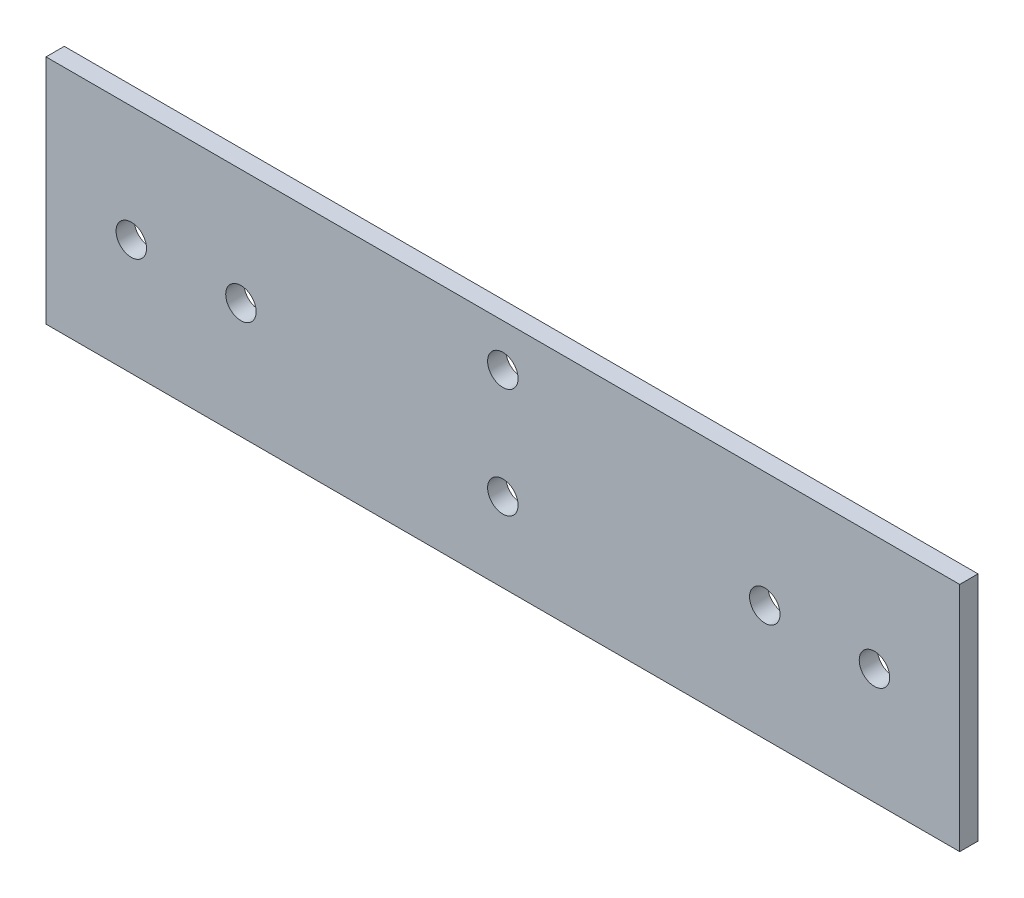
ISO-10303-21;
HEADER;
FILE_DESCRIPTION(('STEP AP214'),'2;1');
FILE_NAME('part.step','',(''),(''),'','','');
FILE_SCHEMA(('AUTOMOTIVE_DESIGN { 1 0 10303 214 1 1 1 1 }'));
ENDSEC;
DATA;
#1=APPLICATION_CONTEXT('core data for automotive mechanical design processes');
#2=APPLICATION_PROTOCOL_DEFINITION('international standard','automotive_design',2000,#1);
#3=PRODUCT_CONTEXT('',#1,'mechanical');
#4=PRODUCT('Part','Part','',(#3));
#5=PRODUCT_RELATED_PRODUCT_CATEGORY('part','',(#4));
#6=PRODUCT_DEFINITION_FORMATION('','',#4);
#7=PRODUCT_DEFINITION_CONTEXT('part definition',#1,'design');
#8=PRODUCT_DEFINITION('design','',#6,#7);
#9=PRODUCT_DEFINITION_SHAPE('','',#8);
#10=(LENGTH_UNIT() NAMED_UNIT(*) SI_UNIT(.MILLI.,.METRE.));
#11=(NAMED_UNIT(*) PLANE_ANGLE_UNIT() SI_UNIT($,.RADIAN.));
#12=(NAMED_UNIT(*) SI_UNIT($,.STERADIAN.) SOLID_ANGLE_UNIT());
#13=UNCERTAINTY_MEASURE_WITH_UNIT(LENGTH_MEASURE(1.E-05),#10,'distance_accuracy_value','');
#14=(GEOMETRIC_REPRESENTATION_CONTEXT(3) GLOBAL_UNCERTAINTY_ASSIGNED_CONTEXT((#13)) GLOBAL_UNIT_ASSIGNED_CONTEXT((#10,
#11,#12)) REPRESENTATION_CONTEXT('',''));
#15=CARTESIAN_POINT('',(0.,0.,0.));
#16=DIRECTION('',(0.,0.,1.));
#17=DIRECTION('',(1.,0.,0.));
#18=AXIS2_PLACEMENT_3D('',#15,#16,#17);
#19=CARTESIAN_POINT('',(75.,19.,3.));
#20=DIRECTION('',(-1.,0.,0.));
#21=DIRECTION('',(0.,0.,1.));
#22=AXIS2_PLACEMENT_3D('',#19,#20,#21);
#23=PLANE('',#22);
#24=DIRECTION('',(0.,1.,0.));
#25=VECTOR('',#24,1.);
#26=CARTESIAN_POINT('',(75.,19.,0.));
#27=LINE('',#26,#25);
#28=CARTESIAN_POINT('',(75.,-19.,0.));
#29=VERTEX_POINT('',#28);
#30=CARTESIAN_POINT('',(75.,19.,0.));
#31=VERTEX_POINT('',#30);
#32=EDGE_CURVE('E106',#29,#31,#27,.T.);
#33=ORIENTED_EDGE('',*,*,#32,.T.);
#34=DIRECTION('',(0.,0.,-1.));
#35=VECTOR('',#34,1.);
#36=CARTESIAN_POINT('',(75.,19.,3.));
#37=LINE('',#36,#35);
#38=CARTESIAN_POINT('',(75.,19.,3.));
#39=VERTEX_POINT('',#38);
#40=EDGE_CURVE('E11',#39,#31,#37,.T.);
#41=ORIENTED_EDGE('',*,*,#40,.F.);
#42=DIRECTION('',(0.,1.,0.));
#43=VECTOR('',#42,1.);
#44=CARTESIAN_POINT('',(75.,19.,3.));
#45=LINE('',#44,#43);
#46=CARTESIAN_POINT('',(75.,-19.,3.));
#47=VERTEX_POINT('',#46);
#48=EDGE_CURVE('E90',#47,#39,#45,.T.);
#49=ORIENTED_EDGE('',*,*,#48,.F.);
#50=DIRECTION('',(0.,0.,-1.));
#51=VECTOR('',#50,1.);
#52=CARTESIAN_POINT('',(75.,-19.,3.));
#53=LINE('',#52,#51);
#54=EDGE_CURVE('E102',#47,#29,#53,.T.);
#55=ORIENTED_EDGE('',*,*,#54,.T.);
#56=EDGE_LOOP('',(#33,#41,#49,#55));
#57=FACE_BOUND('',#56,.T.);
#58=ADVANCED_FACE('F38',(#57),#23,.F.);
#59=CARTESIAN_POINT('',(-75.,19.,3.));
#60=DIRECTION('',(0.,-1.,0.));
#61=DIRECTION('',(0.,0.,-1.));
#62=AXIS2_PLACEMENT_3D('',#59,#60,#61);
#63=PLANE('',#62);
#64=DIRECTION('',(-1.,0.,0.));
#65=VECTOR('',#64,1.);
#66=CARTESIAN_POINT('',(-75.,19.,0.));
#67=LINE('',#66,#65);
#68=CARTESIAN_POINT('',(-75.,19.,0.));
#69=VERTEX_POINT('',#68);
#70=EDGE_CURVE('E95',#31,#69,#67,.T.);
#71=ORIENTED_EDGE('',*,*,#70,.T.);
#72=DIRECTION('',(0.,0.,-1.));
#73=VECTOR('',#72,1.);
#74=CARTESIAN_POINT('',(-75.,19.,3.));
#75=LINE('',#74,#73);
#76=CARTESIAN_POINT('',(-75.,19.,3.));
#77=VERTEX_POINT('',#76);
#78=EDGE_CURVE('E47',#77,#69,#75,.T.);
#79=ORIENTED_EDGE('',*,*,#78,.F.);
#80=DIRECTION('',(-1.,0.,0.));
#81=VECTOR('',#80,1.);
#82=CARTESIAN_POINT('',(-75.,19.,3.));
#83=LINE('',#82,#81);
#84=EDGE_CURVE('E85',#39,#77,#83,.T.);
#85=ORIENTED_EDGE('',*,*,#84,.F.);
#86=ORIENTED_EDGE('',*,*,#40,.T.);
#87=EDGE_LOOP('',(#71,#79,#85,#86));
#88=FACE_BOUND('',#87,.T.);
#89=ADVANCED_FACE('F94',(#88),#63,.F.);
#90=CARTESIAN_POINT('',(-75.,19.,3.));
#91=DIRECTION('',(1.,0.,0.));
#92=DIRECTION('',(0.,0.,-1.));
#93=AXIS2_PLACEMENT_3D('',#90,#91,#92);
#94=PLANE('',#93);
#95=DIRECTION('',(0.,-1.,0.));
#96=VECTOR('',#95,1.);
#97=CARTESIAN_POINT('',(-75.,19.,0.));
#98=LINE('',#97,#96);
#99=CARTESIAN_POINT('',(-75.,-19.,0.));
#100=VERTEX_POINT('',#99);
#101=EDGE_CURVE('E72',#69,#100,#98,.T.);
#102=ORIENTED_EDGE('',*,*,#101,.T.);
#103=DIRECTION('',(0.,0.,-1.));
#104=VECTOR('',#103,1.);
#105=CARTESIAN_POINT('',(-75.,-19.,3.));
#106=LINE('',#105,#104);
#107=CARTESIAN_POINT('',(-75.,-19.,3.));
#108=VERTEX_POINT('',#107);
#109=EDGE_CURVE('E97',#108,#100,#106,.T.);
#110=ORIENTED_EDGE('',*,*,#109,.F.);
#111=DIRECTION('',(0.,-1.,0.));
#112=VECTOR('',#111,1.);
#113=CARTESIAN_POINT('',(-75.,19.,3.));
#114=LINE('',#113,#112);
#115=EDGE_CURVE('E88',#77,#108,#114,.T.);
#116=ORIENTED_EDGE('',*,*,#115,.F.);
#117=ORIENTED_EDGE('',*,*,#78,.T.);
#118=EDGE_LOOP('',(#102,#110,#116,#117));
#119=FACE_BOUND('',#118,.T.);
#120=ADVANCED_FACE('F98',(#119),#94,.F.);
#121=CARTESIAN_POINT('',(-75.,-19.,3.));
#122=DIRECTION('',(0.,1.,0.));
#123=DIRECTION('',(0.,0.,1.));
#124=AXIS2_PLACEMENT_3D('',#121,#122,#123);
#125=PLANE('',#124);
#126=DIRECTION('',(1.,0.,0.));
#127=VECTOR('',#126,1.);
#128=CARTESIAN_POINT('',(-75.,-19.,0.));
#129=LINE('',#128,#127);
#130=EDGE_CURVE('E78',#100,#29,#129,.T.);
#131=ORIENTED_EDGE('',*,*,#130,.T.);
#132=ORIENTED_EDGE('',*,*,#54,.F.);
#133=DIRECTION('',(1.,0.,0.));
#134=VECTOR('',#133,1.);
#135=CARTESIAN_POINT('',(-75.,-19.,3.));
#136=LINE('',#135,#134);
#137=EDGE_CURVE('E55',#108,#47,#136,.T.);
#138=ORIENTED_EDGE('',*,*,#137,.F.);
#139=ORIENTED_EDGE('',*,*,#109,.T.);
#140=EDGE_LOOP('',(#131,#132,#138,#139));
#141=FACE_BOUND('',#140,.T.);
#142=ADVANCED_FACE('F120',(#141),#125,.F.);
#143=CARTESIAN_POINT('',(0.,0.,3.));
#144=DIRECTION('',(0.,0.,1.));
#145=DIRECTION('',(1.,0.,0.));
#146=AXIS2_PLACEMENT_3D('',#143,#144,#145);
#147=PLANE('',#146);
#148=CARTESIAN_POINT('',(0.,-6.,3.));
#149=DIRECTION('',(0.,0.,1.));
#150=DIRECTION('',(1.,0.,0.));
#151=AXIS2_PLACEMENT_3D('',#148,#149,#150);
#152=CIRCLE('',#151,2.5);
#153=CARTESIAN_POINT('',(-2.5,-6.,3.));
#154=VERTEX_POINT('',#153);
#155=EDGE_CURVE('E167',#154,#154,#152,.F.);
#156=ORIENTED_EDGE('',*,*,#155,.T.);
#157=EDGE_LOOP('',(#156));
#158=FACE_BOUND('',#157,.T.);
#159=CARTESIAN_POINT('',(0.,12.,3.));
#160=DIRECTION('',(0.,0.,1.));
#161=DIRECTION('',(1.,0.,0.));
#162=AXIS2_PLACEMENT_3D('',#159,#160,#161);
#163=CIRCLE('',#162,2.5);
#164=CARTESIAN_POINT('',(-2.5,12.,3.));
#165=VERTEX_POINT('',#164);
#166=EDGE_CURVE('E159',#165,#165,#163,.F.);
#167=ORIENTED_EDGE('',*,*,#166,.T.);
#168=EDGE_LOOP('',(#167));
#169=FACE_BOUND('',#168,.T.);
#170=CARTESIAN_POINT('',(-61.,0.,3.));
#171=DIRECTION('',(0.,0.,1.));
#172=DIRECTION('',(1.,0.,0.));
#173=AXIS2_PLACEMENT_3D('',#170,#171,#172);
#174=CIRCLE('',#173,2.50000000000001);
#175=CARTESIAN_POINT('',(-63.5,0.,3.));
#176=VERTEX_POINT('',#175);
#177=EDGE_CURVE('E132',#176,#176,#174,.T.);
#178=ORIENTED_EDGE('',*,*,#177,.F.);
#179=EDGE_LOOP('',(#178));
#180=FACE_BOUND('',#179,.T.);
#181=CARTESIAN_POINT('',(-43.,0.,3.));
#182=DIRECTION('',(0.,0.,1.));
#183=DIRECTION('',(1.,0.,0.));
#184=AXIS2_PLACEMENT_3D('',#181,#182,#183);
#185=CIRCLE('',#184,2.5);
#186=CARTESIAN_POINT('',(-45.5,0.,3.));
#187=VERTEX_POINT('',#186);
#188=EDGE_CURVE('E143',#187,#187,#185,.T.);
#189=ORIENTED_EDGE('',*,*,#188,.F.);
#190=EDGE_LOOP('',(#189));
#191=FACE_BOUND('',#190,.T.);
#192=CARTESIAN_POINT('',(61.,0.,3.));
#193=DIRECTION('',(0.,0.,1.));
#194=DIRECTION('',(1.,0.,0.));
#195=AXIS2_PLACEMENT_3D('',#192,#193,#194);
#196=CIRCLE('',#195,2.50000000000001);
#197=CARTESIAN_POINT('',(58.5,0.,3.));
#198=VERTEX_POINT('',#197);
#199=EDGE_CURVE('E136',#198,#198,#196,.F.);
#200=ORIENTED_EDGE('',*,*,#199,.T.);
#201=EDGE_LOOP('',(#200));
#202=FACE_BOUND('',#201,.T.);
#203=CARTESIAN_POINT('',(43.,0.,3.));
#204=DIRECTION('',(0.,0.,1.));
#205=DIRECTION('',(1.,0.,0.));
#206=AXIS2_PLACEMENT_3D('',#203,#204,#205);
#207=CIRCLE('',#206,2.5);
#208=CARTESIAN_POINT('',(40.5,0.,3.));
#209=VERTEX_POINT('',#208);
#210=EDGE_CURVE('E127',#209,#209,#207,.F.);
#211=ORIENTED_EDGE('',*,*,#210,.T.);
#212=EDGE_LOOP('',(#211));
#213=FACE_BOUND('',#212,.T.);
#214=ORIENTED_EDGE('',*,*,#48,.T.);
#215=ORIENTED_EDGE('',*,*,#84,.T.);
#216=ORIENTED_EDGE('',*,*,#115,.T.);
#217=ORIENTED_EDGE('',*,*,#137,.T.);
#218=EDGE_LOOP('',(#214,#215,#216,#217));
#219=FACE_BOUND('',#218,.T.);
#220=ADVANCED_FACE('F86',(#158,#169,#180,#191,#202,#213,#219),#147,.T.);
#221=CARTESIAN_POINT('',(0.,0.,0.));
#222=DIRECTION('',(0.,0.,1.));
#223=DIRECTION('',(1.,0.,0.));
#224=AXIS2_PLACEMENT_3D('',#221,#222,#223);
#225=PLANE('',#224);
#226=CARTESIAN_POINT('',(0.,-6.,0.));
#227=DIRECTION('',(0.,0.,-1.));
#228=DIRECTION('',(-1.,0.,0.));
#229=AXIS2_PLACEMENT_3D('',#226,#227,#228);
#230=CIRCLE('',#229,2.5);
#231=CARTESIAN_POINT('',(-2.5,-6.,0.));
#232=VERTEX_POINT('',#231);
#233=EDGE_CURVE('E152',#232,#232,#230,.T.);
#234=ORIENTED_EDGE('',*,*,#233,.F.);
#235=EDGE_LOOP('',(#234));
#236=FACE_BOUND('',#235,.T.);
#237=CARTESIAN_POINT('',(0.,12.,0.));
#238=DIRECTION('',(0.,0.,-1.));
#239=DIRECTION('',(-1.,0.,0.));
#240=AXIS2_PLACEMENT_3D('',#237,#238,#239);
#241=CIRCLE('',#240,2.5);
#242=CARTESIAN_POINT('',(-2.5,12.,0.));
#243=VERTEX_POINT('',#242);
#244=EDGE_CURVE('E163',#243,#243,#241,.T.);
#245=ORIENTED_EDGE('',*,*,#244,.F.);
#246=EDGE_LOOP('',(#245));
#247=FACE_BOUND('',#246,.T.);
#248=CARTESIAN_POINT('',(-61.,0.,0.));
#249=DIRECTION('',(0.,0.,1.));
#250=DIRECTION('',(1.,0.,0.));
#251=AXIS2_PLACEMENT_3D('',#248,#249,#250);
#252=CIRCLE('',#251,2.50000000000001);
#253=CARTESIAN_POINT('',(-63.5,0.,0.));
#254=VERTEX_POINT('',#253);
#255=EDGE_CURVE('E147',#254,#254,#252,.T.);
#256=ORIENTED_EDGE('',*,*,#255,.T.);
#257=EDGE_LOOP('',(#256));
#258=FACE_BOUND('',#257,.T.);
#259=CARTESIAN_POINT('',(-43.,0.,0.));
#260=DIRECTION('',(0.,0.,1.));
#261=DIRECTION('',(1.,0.,0.));
#262=AXIS2_PLACEMENT_3D('',#259,#260,#261);
#263=CIRCLE('',#262,2.5);
#264=CARTESIAN_POINT('',(-45.5,0.,0.));
#265=VERTEX_POINT('',#264);
#266=EDGE_CURVE('E148',#265,#265,#263,.T.);
#267=ORIENTED_EDGE('',*,*,#266,.T.);
#268=EDGE_LOOP('',(#267));
#269=FACE_BOUND('',#268,.T.);
#270=CARTESIAN_POINT('',(61.,0.,0.));
#271=DIRECTION('',(0.,0.,-1.));
#272=DIRECTION('',(-1.,0.,0.));
#273=AXIS2_PLACEMENT_3D('',#270,#271,#272);
#274=CIRCLE('',#273,2.50000000000001);
#275=CARTESIAN_POINT('',(58.5,0.,0.));
#276=VERTEX_POINT('',#275);
#277=EDGE_CURVE('E110',#276,#276,#274,.T.);
#278=ORIENTED_EDGE('',*,*,#277,.F.);
#279=EDGE_LOOP('',(#278));
#280=FACE_BOUND('',#279,.T.);
#281=CARTESIAN_POINT('',(43.,0.,0.));
#282=DIRECTION('',(0.,0.,-1.));
#283=DIRECTION('',(-1.,0.,0.));
#284=AXIS2_PLACEMENT_3D('',#281,#282,#283);
#285=CIRCLE('',#284,2.5);
#286=CARTESIAN_POINT('',(40.5,0.,0.));
#287=VERTEX_POINT('',#286);
#288=EDGE_CURVE('E131',#287,#287,#285,.T.);
#289=ORIENTED_EDGE('',*,*,#288,.F.);
#290=EDGE_LOOP('',(#289));
#291=FACE_BOUND('',#290,.T.);
#292=ORIENTED_EDGE('',*,*,#32,.F.);
#293=ORIENTED_EDGE('',*,*,#130,.F.);
#294=ORIENTED_EDGE('',*,*,#101,.F.);
#295=ORIENTED_EDGE('',*,*,#70,.F.);
#296=EDGE_LOOP('',(#292,#293,#294,#295));
#297=FACE_BOUND('',#296,.T.);
#298=ADVANCED_FACE('F123',(#236,#247,#258,#269,#280,#291,#297),#225,.F.);
#299=CARTESIAN_POINT('',(43.,0.,3.001));
#300=DIRECTION('',(0.,0.,-1.));
#301=DIRECTION('',(-1.,0.,0.));
#302=AXIS2_PLACEMENT_3D('',#299,#300,#301);
#303=CYLINDRICAL_SURFACE('',#302,2.5);
#304=CARTESIAN_POINT('',(40.5,0.,3.));
#305=CARTESIAN_POINT('',(40.5,0.,2.96875));
#306=CARTESIAN_POINT('',(40.5,0.,2.9375));
#307=CARTESIAN_POINT('',(40.5,0.,2.875));
#308=CARTESIAN_POINT('',(40.5,0.,2.84375));
#309=CARTESIAN_POINT('',(40.5,0.,2.78125));
#310=CARTESIAN_POINT('',(40.5,0.,2.75));
#311=CARTESIAN_POINT('',(40.5,0.,2.6875));
#312=CARTESIAN_POINT('',(40.5,0.,2.65625));
#313=CARTESIAN_POINT('',(40.5,0.,2.59375));
#314=CARTESIAN_POINT('',(40.5,0.,2.5625));
#315=CARTESIAN_POINT('',(40.5,0.,2.5));
#316=CARTESIAN_POINT('',(40.5,0.,2.46875));
#317=CARTESIAN_POINT('',(40.5,0.,2.40625));
#318=CARTESIAN_POINT('',(40.5,0.,2.375));
#319=CARTESIAN_POINT('',(40.5,0.,2.3125));
#320=CARTESIAN_POINT('',(40.5,0.,2.28125));
#321=CARTESIAN_POINT('',(40.5,0.,2.21875));
#322=CARTESIAN_POINT('',(40.5,0.,2.1875));
#323=CARTESIAN_POINT('',(40.5,0.,2.125));
#324=CARTESIAN_POINT('',(40.5,0.,2.09375));
#325=CARTESIAN_POINT('',(40.5,0.,2.03125));
#326=CARTESIAN_POINT('',(40.5,0.,2.));
#327=CARTESIAN_POINT('',(40.5,0.,1.9375));
#328=CARTESIAN_POINT('',(40.5,0.,1.90625));
#329=CARTESIAN_POINT('',(40.5,0.,1.84375));
#330=CARTESIAN_POINT('',(40.5,0.,1.8125));
#331=CARTESIAN_POINT('',(40.5,0.,1.75));
#332=CARTESIAN_POINT('',(40.5,0.,1.71875));
#333=CARTESIAN_POINT('',(40.5,0.,1.65625));
#334=CARTESIAN_POINT('',(40.5,0.,1.625));
#335=CARTESIAN_POINT('',(40.5,0.,1.5625));
#336=CARTESIAN_POINT('',(40.5,0.,1.53125));
#337=CARTESIAN_POINT('',(40.5,0.,1.46875));
#338=CARTESIAN_POINT('',(40.5,0.,1.4375));
#339=CARTESIAN_POINT('',(40.5,0.,1.375));
#340=CARTESIAN_POINT('',(40.5,0.,1.34375));
#341=CARTESIAN_POINT('',(40.5,0.,1.28125));
#342=CARTESIAN_POINT('',(40.5,0.,1.25));
#343=CARTESIAN_POINT('',(40.5,0.,1.1875));
#344=CARTESIAN_POINT('',(40.5,0.,1.15625));
#345=CARTESIAN_POINT('',(40.5,0.,1.09375));
#346=CARTESIAN_POINT('',(40.5,0.,1.0625));
#347=CARTESIAN_POINT('',(40.5,0.,1.));
#348=CARTESIAN_POINT('',(40.5,0.,0.96875));
#349=CARTESIAN_POINT('',(40.5,0.,0.90625));
#350=CARTESIAN_POINT('',(40.5,0.,0.875));
#351=CARTESIAN_POINT('',(40.5,0.,0.8125));
#352=CARTESIAN_POINT('',(40.5,0.,0.78125));
#353=CARTESIAN_POINT('',(40.5,0.,0.71875));
#354=CARTESIAN_POINT('',(40.5,0.,0.6875));
#355=CARTESIAN_POINT('',(40.5,0.,0.625));
#356=CARTESIAN_POINT('',(40.5,0.,0.59375));
#357=CARTESIAN_POINT('',(40.5,0.,0.53125));
#358=CARTESIAN_POINT('',(40.5,0.,0.5));
#359=CARTESIAN_POINT('',(40.5,0.,0.4375));
#360=CARTESIAN_POINT('',(40.5,0.,0.40625));
#361=CARTESIAN_POINT('',(40.5,0.,0.34375));
#362=CARTESIAN_POINT('',(40.5,0.,0.3125));
#363=CARTESIAN_POINT('',(40.5,0.,0.25));
#364=CARTESIAN_POINT('',(40.5,0.,0.21875));
#365=CARTESIAN_POINT('',(40.5,0.,0.156250000000001));
#366=CARTESIAN_POINT('',(40.5,0.,0.125000000000001));
#367=CARTESIAN_POINT('',(40.5,0.,0.0625000000000005));
#368=CARTESIAN_POINT('',(40.5,0.,0.0312500000000005));
#369=CARTESIAN_POINT('',(40.5,0.,0.));
#370=B_SPLINE_CURVE_WITH_KNOTS('',3,(#304,#305,#306,#307,#308,#309,#310,#311,#312,#313,#314,
#315,#316,#317,#318,#319,#320,#321,#322,#323,#324,#325,#326,#327,#328,#329,#330,#331,#332,#333,
#334,#335,#336,#337,#338,#339,#340,#341,#342,#343,#344,#345,#346,#347,#348,#349,#350,#351,#352,
#353,#354,#355,#356,#357,#358,#359,#360,#361,#362,#363,#364,#365,#366,#367,#368,#369),
.UNSPECIFIED.,.F.,.F.,(4,2,2,2,2,2,2,2,2,2,2,2,2,2,2,2,2,2,2,2,2,2,2,2,2,2,2,2,2,2,2,2,4),(0.,
0.0937499999999997,0.1875,0.28125,0.375,0.46875,0.5625,0.65625,0.749999999999999,
0.843749999999999,0.9375,1.03125,1.125,1.21875,1.3125,1.40625,1.5,1.59375,1.6875,1.78125,1.875,
1.96875,2.0625,2.15625,2.25,2.34375,2.4375,2.53125,2.625,2.71875,2.8125,2.90625,3.),.UNSPECIFIED.);
#371=EDGE_CURVE('BSEAM179',#209,#287,#370,.T.);
#372=ORIENTED_EDGE('',*,*,#210,.F.);
#373=ORIENTED_EDGE('',*,*,#288,.T.);
#374=ORIENTED_EDGE('',*,*,#371,.T.);
#375=ORIENTED_EDGE('',*,*,#371,.F.);
#376=EDGE_LOOP('',(#372,#374,#373,#375));
#377=FACE_BOUND('',#376,.T.);
#378=ADVANCED_FACE('F179',(#377),#303,.F.);
#379=CARTESIAN_POINT('',(61.,0.,3.001));
#380=DIRECTION('',(0.,0.,-1.));
#381=DIRECTION('',(-1.,0.,0.));
#382=AXIS2_PLACEMENT_3D('',#379,#380,#381);
#383=CYLINDRICAL_SURFACE('',#382,2.50000000000001);
#384=CARTESIAN_POINT('',(58.5,0.,3.));
#385=CARTESIAN_POINT('',(58.5,0.,2.96875));
#386=CARTESIAN_POINT('',(58.5,0.,2.9375));
#387=CARTESIAN_POINT('',(58.5,0.,2.875));
#388=CARTESIAN_POINT('',(58.5,0.,2.84375));
#389=CARTESIAN_POINT('',(58.5,0.,2.78125));
#390=CARTESIAN_POINT('',(58.5,0.,2.75));
#391=CARTESIAN_POINT('',(58.5,0.,2.6875));
#392=CARTESIAN_POINT('',(58.5,0.,2.65625));
#393=CARTESIAN_POINT('',(58.5,0.,2.59375));
#394=CARTESIAN_POINT('',(58.5,0.,2.5625));
#395=CARTESIAN_POINT('',(58.5,0.,2.5));
#396=CARTESIAN_POINT('',(58.5,0.,2.46875));
#397=CARTESIAN_POINT('',(58.5,0.,2.40625));
#398=CARTESIAN_POINT('',(58.5,0.,2.375));
#399=CARTESIAN_POINT('',(58.5,0.,2.3125));
#400=CARTESIAN_POINT('',(58.5,0.,2.28125));
#401=CARTESIAN_POINT('',(58.5,0.,2.21875));
#402=CARTESIAN_POINT('',(58.5,0.,2.1875));
#403=CARTESIAN_POINT('',(58.5,0.,2.125));
#404=CARTESIAN_POINT('',(58.5,0.,2.09375));
#405=CARTESIAN_POINT('',(58.5,0.,2.03125));
#406=CARTESIAN_POINT('',(58.5,0.,2.));
#407=CARTESIAN_POINT('',(58.5,0.,1.9375));
#408=CARTESIAN_POINT('',(58.5,0.,1.90625));
#409=CARTESIAN_POINT('',(58.5,0.,1.84375));
#410=CARTESIAN_POINT('',(58.5,0.,1.8125));
#411=CARTESIAN_POINT('',(58.5,0.,1.75));
#412=CARTESIAN_POINT('',(58.5,0.,1.71875));
#413=CARTESIAN_POINT('',(58.5,0.,1.65625));
#414=CARTESIAN_POINT('',(58.5,0.,1.625));
#415=CARTESIAN_POINT('',(58.5,0.,1.5625));
#416=CARTESIAN_POINT('',(58.5,0.,1.53125));
#417=CARTESIAN_POINT('',(58.5,0.,1.46875));
#418=CARTESIAN_POINT('',(58.5,0.,1.4375));
#419=CARTESIAN_POINT('',(58.5,0.,1.375));
#420=CARTESIAN_POINT('',(58.5,0.,1.34375));
#421=CARTESIAN_POINT('',(58.5,0.,1.28125));
#422=CARTESIAN_POINT('',(58.5,0.,1.25));
#423=CARTESIAN_POINT('',(58.5,0.,1.1875));
#424=CARTESIAN_POINT('',(58.5,0.,1.15625));
#425=CARTESIAN_POINT('',(58.5,0.,1.09375));
#426=CARTESIAN_POINT('',(58.5,0.,1.0625));
#427=CARTESIAN_POINT('',(58.5,0.,1.));
#428=CARTESIAN_POINT('',(58.5,0.,0.96875));
#429=CARTESIAN_POINT('',(58.5,0.,0.90625));
#430=CARTESIAN_POINT('',(58.5,0.,0.875));
#431=CARTESIAN_POINT('',(58.5,0.,0.8125));
#432=CARTESIAN_POINT('',(58.5,0.,0.78125));
#433=CARTESIAN_POINT('',(58.5,0.,0.71875));
#434=CARTESIAN_POINT('',(58.5,0.,0.6875));
#435=CARTESIAN_POINT('',(58.5,0.,0.625));
#436=CARTESIAN_POINT('',(58.5,0.,0.59375));
#437=CARTESIAN_POINT('',(58.5,0.,0.53125));
#438=CARTESIAN_POINT('',(58.5,0.,0.5));
#439=CARTESIAN_POINT('',(58.5,0.,0.4375));
#440=CARTESIAN_POINT('',(58.5,0.,0.40625));
#441=CARTESIAN_POINT('',(58.5,0.,0.34375));
#442=CARTESIAN_POINT('',(58.5,0.,0.3125));
#443=CARTESIAN_POINT('',(58.5,0.,0.25));
#444=CARTESIAN_POINT('',(58.5,0.,0.21875));
#445=CARTESIAN_POINT('',(58.5,0.,0.156250000000001));
#446=CARTESIAN_POINT('',(58.5,0.,0.125000000000001));
#447=CARTESIAN_POINT('',(58.5,0.,0.0625000000000005));
#448=CARTESIAN_POINT('',(58.5,0.,0.0312500000000005));
#449=CARTESIAN_POINT('',(58.5,0.,0.));
#450=B_SPLINE_CURVE_WITH_KNOTS('',3,(#384,#385,#386,#387,#388,#389,#390,#391,#392,#393,#394,
#395,#396,#397,#398,#399,#400,#401,#402,#403,#404,#405,#406,#407,#408,#409,#410,#411,#412,#413,
#414,#415,#416,#417,#418,#419,#420,#421,#422,#423,#424,#425,#426,#427,#428,#429,#430,#431,#432,
#433,#434,#435,#436,#437,#438,#439,#440,#441,#442,#443,#444,#445,#446,#447,#448,#449),
.UNSPECIFIED.,.F.,.F.,(4,2,2,2,2,2,2,2,2,2,2,2,2,2,2,2,2,2,2,2,2,2,2,2,2,2,2,2,2,2,2,2,4),(0.,
0.0937499999999997,0.1875,0.28125,0.375,0.46875,0.5625,0.65625,0.749999999999999,
0.843749999999999,0.9375,1.03125,1.125,1.21875,1.3125,1.40625,1.5,1.59375,1.6875,1.78125,1.875,
1.96875,2.0625,2.15625,2.25,2.34375,2.4375,2.53125,2.625,2.71875,2.8125,2.90625,3.),.UNSPECIFIED.);
#451=EDGE_CURVE('BSEAM192',#198,#276,#450,.T.);
#452=ORIENTED_EDGE('',*,*,#199,.F.);
#453=ORIENTED_EDGE('',*,*,#277,.T.);
#454=ORIENTED_EDGE('',*,*,#451,.T.);
#455=ORIENTED_EDGE('',*,*,#451,.F.);
#456=EDGE_LOOP('',(#452,#454,#453,#455));
#457=FACE_BOUND('',#456,.T.);
#458=ADVANCED_FACE('F192',(#457),#383,.F.);
#459=CARTESIAN_POINT('',(-43.,0.,3.001));
#460=DIRECTION('',(0.,0.,-1.));
#461=DIRECTION('',(-1.,0.,0.));
#462=AXIS2_PLACEMENT_3D('',#459,#460,#461);
#463=CYLINDRICAL_SURFACE('',#462,2.5);
#464=CARTESIAN_POINT('',(-45.5,0.,3.));
#465=CARTESIAN_POINT('',(-45.5,0.,2.96875));
#466=CARTESIAN_POINT('',(-45.5,0.,2.9375));
#467=CARTESIAN_POINT('',(-45.5,0.,2.875));
#468=CARTESIAN_POINT('',(-45.5,0.,2.84375));
#469=CARTESIAN_POINT('',(-45.5,0.,2.78125));
#470=CARTESIAN_POINT('',(-45.5,0.,2.75));
#471=CARTESIAN_POINT('',(-45.5,0.,2.6875));
#472=CARTESIAN_POINT('',(-45.5,0.,2.65625));
#473=CARTESIAN_POINT('',(-45.5,0.,2.59375));
#474=CARTESIAN_POINT('',(-45.5,0.,2.5625));
#475=CARTESIAN_POINT('',(-45.5,0.,2.5));
#476=CARTESIAN_POINT('',(-45.5,0.,2.46875));
#477=CARTESIAN_POINT('',(-45.5,0.,2.40625));
#478=CARTESIAN_POINT('',(-45.5,0.,2.375));
#479=CARTESIAN_POINT('',(-45.5,0.,2.3125));
#480=CARTESIAN_POINT('',(-45.5,0.,2.28125));
#481=CARTESIAN_POINT('',(-45.5,0.,2.21875));
#482=CARTESIAN_POINT('',(-45.5,0.,2.1875));
#483=CARTESIAN_POINT('',(-45.5,0.,2.125));
#484=CARTESIAN_POINT('',(-45.5,0.,2.09375));
#485=CARTESIAN_POINT('',(-45.5,0.,2.03125));
#486=CARTESIAN_POINT('',(-45.5,0.,2.));
#487=CARTESIAN_POINT('',(-45.5,0.,1.9375));
#488=CARTESIAN_POINT('',(-45.5,0.,1.90625));
#489=CARTESIAN_POINT('',(-45.5,0.,1.84375));
#490=CARTESIAN_POINT('',(-45.5,0.,1.8125));
#491=CARTESIAN_POINT('',(-45.5,0.,1.75));
#492=CARTESIAN_POINT('',(-45.5,0.,1.71875));
#493=CARTESIAN_POINT('',(-45.5,0.,1.65625));
#494=CARTESIAN_POINT('',(-45.5,0.,1.625));
#495=CARTESIAN_POINT('',(-45.5,0.,1.5625));
#496=CARTESIAN_POINT('',(-45.5,0.,1.53125));
#497=CARTESIAN_POINT('',(-45.5,0.,1.46875));
#498=CARTESIAN_POINT('',(-45.5,0.,1.4375));
#499=CARTESIAN_POINT('',(-45.5,0.,1.375));
#500=CARTESIAN_POINT('',(-45.5,0.,1.34375));
#501=CARTESIAN_POINT('',(-45.5,0.,1.28125));
#502=CARTESIAN_POINT('',(-45.5,0.,1.25));
#503=CARTESIAN_POINT('',(-45.5,0.,1.1875));
#504=CARTESIAN_POINT('',(-45.5,0.,1.15625));
#505=CARTESIAN_POINT('',(-45.5,0.,1.09375));
#506=CARTESIAN_POINT('',(-45.5,0.,1.0625));
#507=CARTESIAN_POINT('',(-45.5,0.,1.));
#508=CARTESIAN_POINT('',(-45.5,0.,0.96875));
#509=CARTESIAN_POINT('',(-45.5,0.,0.90625));
#510=CARTESIAN_POINT('',(-45.5,0.,0.875));
#511=CARTESIAN_POINT('',(-45.5,0.,0.8125));
#512=CARTESIAN_POINT('',(-45.5,0.,0.78125));
#513=CARTESIAN_POINT('',(-45.5,0.,0.71875));
#514=CARTESIAN_POINT('',(-45.5,0.,0.6875));
#515=CARTESIAN_POINT('',(-45.5,0.,0.625));
#516=CARTESIAN_POINT('',(-45.5,0.,0.59375));
#517=CARTESIAN_POINT('',(-45.5,0.,0.53125));
#518=CARTESIAN_POINT('',(-45.5,0.,0.5));
#519=CARTESIAN_POINT('',(-45.5,0.,0.4375));
#520=CARTESIAN_POINT('',(-45.5,0.,0.40625));
#521=CARTESIAN_POINT('',(-45.5,0.,0.34375));
#522=CARTESIAN_POINT('',(-45.5,0.,0.3125));
#523=CARTESIAN_POINT('',(-45.5,0.,0.25));
#524=CARTESIAN_POINT('',(-45.5,0.,0.21875));
#525=CARTESIAN_POINT('',(-45.5,0.,0.15625));
#526=CARTESIAN_POINT('',(-45.5,0.,0.125));
#527=CARTESIAN_POINT('',(-45.5,0.,0.0624999999999996));
#528=CARTESIAN_POINT('',(-45.5,0.,0.0312499999999996));
#529=CARTESIAN_POINT('',(-45.5,0.,0.));
#530=B_SPLINE_CURVE_WITH_KNOTS('',3,(#464,#465,#466,#467,#468,#469,#470,#471,#472,#473,#474,
#475,#476,#477,#478,#479,#480,#481,#482,#483,#484,#485,#486,#487,#488,#489,#490,#491,#492,#493,
#494,#495,#496,#497,#498,#499,#500,#501,#502,#503,#504,#505,#506,#507,#508,#509,#510,#511,#512,
#513,#514,#515,#516,#517,#518,#519,#520,#521,#522,#523,#524,#525,#526,#527,#528,#529),
.UNSPECIFIED.,.F.,.F.,(4,2,2,2,2,2,2,2,2,2,2,2,2,2,2,2,2,2,2,2,2,2,2,2,2,2,2,2,2,2,2,2,4),(0.,
0.0937499999999997,0.1875,0.28125,0.375,0.46875,0.5625,0.65625,0.75,0.84375,0.9375,1.03125,
1.125,1.21875,1.3125,1.40625,1.5,1.59375,1.6875,1.78125,1.875,1.96875,2.0625,2.15625,2.25,
2.34375,2.4375,2.53125,2.625,2.71875,2.8125,2.90625,3.),.UNSPECIFIED.);
#531=EDGE_CURVE('BSEAM199',#187,#265,#530,.T.);
#532=ORIENTED_EDGE('',*,*,#188,.T.);
#533=ORIENTED_EDGE('',*,*,#266,.F.);
#534=ORIENTED_EDGE('',*,*,#531,.T.);
#535=ORIENTED_EDGE('',*,*,#531,.F.);
#536=EDGE_LOOP('',(#532,#534,#533,#535));
#537=FACE_BOUND('',#536,.T.);
#538=ADVANCED_FACE('F199',(#537),#463,.F.);
#539=CARTESIAN_POINT('',(-61.,0.,3.001));
#540=DIRECTION('',(0.,0.,-1.));
#541=DIRECTION('',(-1.,0.,0.));
#542=AXIS2_PLACEMENT_3D('',#539,#540,#541);
#543=CYLINDRICAL_SURFACE('',#542,2.50000000000001);
#544=CARTESIAN_POINT('',(-63.5,0.,3.));
#545=CARTESIAN_POINT('',(-63.5,0.,2.96875));
#546=CARTESIAN_POINT('',(-63.5,0.,2.9375));
#547=CARTESIAN_POINT('',(-63.5,0.,2.875));
#548=CARTESIAN_POINT('',(-63.5,0.,2.84375));
#549=CARTESIAN_POINT('',(-63.5,0.,2.78125));
#550=CARTESIAN_POINT('',(-63.5,0.,2.75));
#551=CARTESIAN_POINT('',(-63.5,0.,2.6875));
#552=CARTESIAN_POINT('',(-63.5,0.,2.65625));
#553=CARTESIAN_POINT('',(-63.5,0.,2.59375));
#554=CARTESIAN_POINT('',(-63.5,0.,2.5625));
#555=CARTESIAN_POINT('',(-63.5,0.,2.5));
#556=CARTESIAN_POINT('',(-63.5,0.,2.46875));
#557=CARTESIAN_POINT('',(-63.5,0.,2.40625));
#558=CARTESIAN_POINT('',(-63.5,0.,2.375));
#559=CARTESIAN_POINT('',(-63.5,0.,2.3125));
#560=CARTESIAN_POINT('',(-63.5,0.,2.28125));
#561=CARTESIAN_POINT('',(-63.5,0.,2.21875));
#562=CARTESIAN_POINT('',(-63.5,0.,2.1875));
#563=CARTESIAN_POINT('',(-63.5,0.,2.125));
#564=CARTESIAN_POINT('',(-63.5,0.,2.09375));
#565=CARTESIAN_POINT('',(-63.5,0.,2.03125));
#566=CARTESIAN_POINT('',(-63.5,0.,2.));
#567=CARTESIAN_POINT('',(-63.5,0.,1.9375));
#568=CARTESIAN_POINT('',(-63.5,0.,1.90625));
#569=CARTESIAN_POINT('',(-63.5,0.,1.84375));
#570=CARTESIAN_POINT('',(-63.5,0.,1.8125));
#571=CARTESIAN_POINT('',(-63.5,0.,1.75));
#572=CARTESIAN_POINT('',(-63.5,0.,1.71875));
#573=CARTESIAN_POINT('',(-63.5,0.,1.65625));
#574=CARTESIAN_POINT('',(-63.5,0.,1.625));
#575=CARTESIAN_POINT('',(-63.5,0.,1.5625));
#576=CARTESIAN_POINT('',(-63.5,0.,1.53125));
#577=CARTESIAN_POINT('',(-63.5,0.,1.46875));
#578=CARTESIAN_POINT('',(-63.5,0.,1.4375));
#579=CARTESIAN_POINT('',(-63.5,0.,1.375));
#580=CARTESIAN_POINT('',(-63.5,0.,1.34375));
#581=CARTESIAN_POINT('',(-63.5,0.,1.28125));
#582=CARTESIAN_POINT('',(-63.5,0.,1.25));
#583=CARTESIAN_POINT('',(-63.5,0.,1.1875));
#584=CARTESIAN_POINT('',(-63.5,0.,1.15625));
#585=CARTESIAN_POINT('',(-63.5,0.,1.09375));
#586=CARTESIAN_POINT('',(-63.5,0.,1.0625));
#587=CARTESIAN_POINT('',(-63.5,0.,1.));
#588=CARTESIAN_POINT('',(-63.5,0.,0.96875));
#589=CARTESIAN_POINT('',(-63.5,0.,0.90625));
#590=CARTESIAN_POINT('',(-63.5,0.,0.875));
#591=CARTESIAN_POINT('',(-63.5,0.,0.8125));
#592=CARTESIAN_POINT('',(-63.5,0.,0.78125));
#593=CARTESIAN_POINT('',(-63.5,0.,0.71875));
#594=CARTESIAN_POINT('',(-63.5,0.,0.6875));
#595=CARTESIAN_POINT('',(-63.5,0.,0.625));
#596=CARTESIAN_POINT('',(-63.5,0.,0.59375));
#597=CARTESIAN_POINT('',(-63.5,0.,0.53125));
#598=CARTESIAN_POINT('',(-63.5,0.,0.5));
#599=CARTESIAN_POINT('',(-63.5,0.,0.4375));
#600=CARTESIAN_POINT('',(-63.5,0.,0.40625));
#601=CARTESIAN_POINT('',(-63.5,0.,0.34375));
#602=CARTESIAN_POINT('',(-63.5,0.,0.3125));
#603=CARTESIAN_POINT('',(-63.5,0.,0.25));
#604=CARTESIAN_POINT('',(-63.5,0.,0.21875));
#605=CARTESIAN_POINT('',(-63.5,0.,0.15625));
#606=CARTESIAN_POINT('',(-63.5,0.,0.125));
#607=CARTESIAN_POINT('',(-63.5,0.,0.0624999999999996));
#608=CARTESIAN_POINT('',(-63.5,0.,0.0312499999999996));
#609=CARTESIAN_POINT('',(-63.5,0.,0.));
#610=B_SPLINE_CURVE_WITH_KNOTS('',3,(#544,#545,#546,#547,#548,#549,#550,#551,#552,#553,#554,
#555,#556,#557,#558,#559,#560,#561,#562,#563,#564,#565,#566,#567,#568,#569,#570,#571,#572,#573,
#574,#575,#576,#577,#578,#579,#580,#581,#582,#583,#584,#585,#586,#587,#588,#589,#590,#591,#592,
#593,#594,#595,#596,#597,#598,#599,#600,#601,#602,#603,#604,#605,#606,#607,#608,#609),
.UNSPECIFIED.,.F.,.F.,(4,2,2,2,2,2,2,2,2,2,2,2,2,2,2,2,2,2,2,2,2,2,2,2,2,2,2,2,2,2,2,2,4),(0.,
0.0937499999999997,0.1875,0.28125,0.375,0.46875,0.5625,0.65625,0.75,0.84375,0.9375,1.03125,
1.125,1.21875,1.3125,1.40625,1.5,1.59375,1.6875,1.78125,1.875,1.96875,2.0625,2.15625,2.25,
2.34375,2.4375,2.53125,2.625,2.71875,2.8125,2.90625,3.),.UNSPECIFIED.);
#611=EDGE_CURVE('BSEAM233',#176,#254,#610,.T.);
#612=ORIENTED_EDGE('',*,*,#177,.T.);
#613=ORIENTED_EDGE('',*,*,#255,.F.);
#614=ORIENTED_EDGE('',*,*,#611,.T.);
#615=ORIENTED_EDGE('',*,*,#611,.F.);
#616=EDGE_LOOP('',(#612,#614,#613,#615));
#617=FACE_BOUND('',#616,.T.);
#618=ADVANCED_FACE('F233',(#617),#543,.F.);
#619=CARTESIAN_POINT('',(0.,12.,3.001));
#620=DIRECTION('',(0.,0.,-1.));
#621=DIRECTION('',(-1.,0.,0.));
#622=AXIS2_PLACEMENT_3D('',#619,#620,#621);
#623=CYLINDRICAL_SURFACE('',#622,2.5);
#624=CARTESIAN_POINT('',(-2.5,12.,3.));
#625=CARTESIAN_POINT('',(-2.5,12.,2.96875));
#626=CARTESIAN_POINT('',(-2.5,12.,2.9375));
#627=CARTESIAN_POINT('',(-2.5,12.,2.875));
#628=CARTESIAN_POINT('',(-2.5,12.,2.84375));
#629=CARTESIAN_POINT('',(-2.5,12.,2.78125));
#630=CARTESIAN_POINT('',(-2.5,12.,2.75));
#631=CARTESIAN_POINT('',(-2.5,12.,2.6875));
#632=CARTESIAN_POINT('',(-2.5,12.,2.65625));
#633=CARTESIAN_POINT('',(-2.5,12.,2.59375));
#634=CARTESIAN_POINT('',(-2.5,12.,2.5625));
#635=CARTESIAN_POINT('',(-2.5,12.,2.5));
#636=CARTESIAN_POINT('',(-2.5,12.,2.46875));
#637=CARTESIAN_POINT('',(-2.5,12.,2.40625));
#638=CARTESIAN_POINT('',(-2.5,12.,2.375));
#639=CARTESIAN_POINT('',(-2.5,12.,2.3125));
#640=CARTESIAN_POINT('',(-2.5,12.,2.28125));
#641=CARTESIAN_POINT('',(-2.5,12.,2.21875));
#642=CARTESIAN_POINT('',(-2.5,12.,2.1875));
#643=CARTESIAN_POINT('',(-2.5,12.,2.125));
#644=CARTESIAN_POINT('',(-2.5,12.,2.09375));
#645=CARTESIAN_POINT('',(-2.5,12.,2.03125));
#646=CARTESIAN_POINT('',(-2.5,12.,2.));
#647=CARTESIAN_POINT('',(-2.5,12.,1.9375));
#648=CARTESIAN_POINT('',(-2.5,12.,1.90625));
#649=CARTESIAN_POINT('',(-2.5,12.,1.84375));
#650=CARTESIAN_POINT('',(-2.5,12.,1.8125));
#651=CARTESIAN_POINT('',(-2.5,12.,1.75));
#652=CARTESIAN_POINT('',(-2.5,12.,1.71875));
#653=CARTESIAN_POINT('',(-2.5,12.,1.65625));
#654=CARTESIAN_POINT('',(-2.5,12.,1.625));
#655=CARTESIAN_POINT('',(-2.5,12.,1.5625));
#656=CARTESIAN_POINT('',(-2.5,12.,1.53125));
#657=CARTESIAN_POINT('',(-2.5,12.,1.46875));
#658=CARTESIAN_POINT('',(-2.5,12.,1.4375));
#659=CARTESIAN_POINT('',(-2.5,12.,1.375));
#660=CARTESIAN_POINT('',(-2.5,12.,1.34375));
#661=CARTESIAN_POINT('',(-2.5,12.,1.28125));
#662=CARTESIAN_POINT('',(-2.5,12.,1.25));
#663=CARTESIAN_POINT('',(-2.5,12.,1.1875));
#664=CARTESIAN_POINT('',(-2.5,12.,1.15625));
#665=CARTESIAN_POINT('',(-2.5,12.,1.09375));
#666=CARTESIAN_POINT('',(-2.5,12.,1.0625));
#667=CARTESIAN_POINT('',(-2.5,12.,1.));
#668=CARTESIAN_POINT('',(-2.5,12.,0.96875));
#669=CARTESIAN_POINT('',(-2.5,12.,0.90625));
#670=CARTESIAN_POINT('',(-2.5,12.,0.875));
#671=CARTESIAN_POINT('',(-2.5,12.,0.8125));
#672=CARTESIAN_POINT('',(-2.5,12.,0.78125));
#673=CARTESIAN_POINT('',(-2.5,12.,0.71875));
#674=CARTESIAN_POINT('',(-2.5,12.,0.6875));
#675=CARTESIAN_POINT('',(-2.5,12.,0.625));
#676=CARTESIAN_POINT('',(-2.5,12.,0.59375));
#677=CARTESIAN_POINT('',(-2.5,12.,0.53125));
#678=CARTESIAN_POINT('',(-2.5,12.,0.5));
#679=CARTESIAN_POINT('',(-2.5,12.,0.4375));
#680=CARTESIAN_POINT('',(-2.5,12.,0.40625));
#681=CARTESIAN_POINT('',(-2.5,12.,0.34375));
#682=CARTESIAN_POINT('',(-2.5,12.,0.3125));
#683=CARTESIAN_POINT('',(-2.5,12.,0.25));
#684=CARTESIAN_POINT('',(-2.5,12.,0.21875));
#685=CARTESIAN_POINT('',(-2.5,12.,0.156250000000001));
#686=CARTESIAN_POINT('',(-2.5,12.,0.125000000000001));
#687=CARTESIAN_POINT('',(-2.5,12.,0.0625000000000005));
#688=CARTESIAN_POINT('',(-2.5,12.,0.0312500000000005));
#689=CARTESIAN_POINT('',(-2.5,12.,0.));
#690=B_SPLINE_CURVE_WITH_KNOTS('',3,(#624,#625,#626,#627,#628,#629,#630,#631,#632,#633,#634,
#635,#636,#637,#638,#639,#640,#641,#642,#643,#644,#645,#646,#647,#648,#649,#650,#651,#652,#653,
#654,#655,#656,#657,#658,#659,#660,#661,#662,#663,#664,#665,#666,#667,#668,#669,#670,#671,#672,
#673,#674,#675,#676,#677,#678,#679,#680,#681,#682,#683,#684,#685,#686,#687,#688,#689),
.UNSPECIFIED.,.F.,.F.,(4,2,2,2,2,2,2,2,2,2,2,2,2,2,2,2,2,2,2,2,2,2,2,2,2,2,2,2,2,2,2,2,4),(0.,
0.0937499999999997,0.1875,0.28125,0.375,0.46875,0.5625,0.65625,0.749999999999999,
0.843749999999999,0.9375,1.03125,1.125,1.21875,1.3125,1.40625,1.5,1.59375,1.6875,1.78125,1.875,
1.96875,2.0625,2.15625,2.25,2.34375,2.4375,2.53125,2.625,2.71875,2.8125,2.90625,3.),.UNSPECIFIED.);
#691=EDGE_CURVE('BSEAM238',#165,#243,#690,.T.);
#692=ORIENTED_EDGE('',*,*,#166,.F.);
#693=ORIENTED_EDGE('',*,*,#244,.T.);
#694=ORIENTED_EDGE('',*,*,#691,.T.);
#695=ORIENTED_EDGE('',*,*,#691,.F.);
#696=EDGE_LOOP('',(#692,#694,#693,#695));
#697=FACE_BOUND('',#696,.T.);
#698=ADVANCED_FACE('F238',(#697),#623,.F.);
#699=CARTESIAN_POINT('',(0.,-6.,3.001));
#700=DIRECTION('',(0.,0.,-1.));
#701=DIRECTION('',(-1.,0.,0.));
#702=AXIS2_PLACEMENT_3D('',#699,#700,#701);
#703=CYLINDRICAL_SURFACE('',#702,2.5);
#704=CARTESIAN_POINT('',(-2.5,-6.,3.));
#705=CARTESIAN_POINT('',(-2.5,-6.,2.96875));
#706=CARTESIAN_POINT('',(-2.5,-6.,2.9375));
#707=CARTESIAN_POINT('',(-2.5,-6.,2.875));
#708=CARTESIAN_POINT('',(-2.5,-6.,2.84375));
#709=CARTESIAN_POINT('',(-2.5,-6.,2.78125));
#710=CARTESIAN_POINT('',(-2.5,-6.,2.75));
#711=CARTESIAN_POINT('',(-2.5,-6.,2.6875));
#712=CARTESIAN_POINT('',(-2.5,-6.,2.65625));
#713=CARTESIAN_POINT('',(-2.5,-6.,2.59375));
#714=CARTESIAN_POINT('',(-2.5,-6.,2.5625));
#715=CARTESIAN_POINT('',(-2.5,-6.,2.5));
#716=CARTESIAN_POINT('',(-2.5,-6.,2.46875));
#717=CARTESIAN_POINT('',(-2.5,-6.,2.40625));
#718=CARTESIAN_POINT('',(-2.5,-6.,2.375));
#719=CARTESIAN_POINT('',(-2.5,-6.,2.3125));
#720=CARTESIAN_POINT('',(-2.5,-6.,2.28125));
#721=CARTESIAN_POINT('',(-2.5,-6.,2.21875));
#722=CARTESIAN_POINT('',(-2.5,-6.,2.1875));
#723=CARTESIAN_POINT('',(-2.5,-6.,2.125));
#724=CARTESIAN_POINT('',(-2.5,-6.,2.09375));
#725=CARTESIAN_POINT('',(-2.5,-6.,2.03125));
#726=CARTESIAN_POINT('',(-2.5,-6.,2.));
#727=CARTESIAN_POINT('',(-2.5,-6.,1.9375));
#728=CARTESIAN_POINT('',(-2.5,-6.,1.90625));
#729=CARTESIAN_POINT('',(-2.5,-6.,1.84375));
#730=CARTESIAN_POINT('',(-2.5,-6.,1.8125));
#731=CARTESIAN_POINT('',(-2.5,-6.,1.75));
#732=CARTESIAN_POINT('',(-2.5,-6.,1.71875));
#733=CARTESIAN_POINT('',(-2.5,-6.,1.65625));
#734=CARTESIAN_POINT('',(-2.5,-6.,1.625));
#735=CARTESIAN_POINT('',(-2.5,-6.,1.5625));
#736=CARTESIAN_POINT('',(-2.5,-6.,1.53125));
#737=CARTESIAN_POINT('',(-2.5,-6.,1.46875));
#738=CARTESIAN_POINT('',(-2.5,-6.,1.4375));
#739=CARTESIAN_POINT('',(-2.5,-6.,1.375));
#740=CARTESIAN_POINT('',(-2.5,-6.,1.34375));
#741=CARTESIAN_POINT('',(-2.5,-6.,1.28125));
#742=CARTESIAN_POINT('',(-2.5,-6.,1.25));
#743=CARTESIAN_POINT('',(-2.5,-6.,1.1875));
#744=CARTESIAN_POINT('',(-2.5,-6.,1.15625));
#745=CARTESIAN_POINT('',(-2.5,-6.,1.09375));
#746=CARTESIAN_POINT('',(-2.5,-6.,1.0625));
#747=CARTESIAN_POINT('',(-2.5,-6.,1.));
#748=CARTESIAN_POINT('',(-2.5,-6.,0.96875));
#749=CARTESIAN_POINT('',(-2.5,-6.,0.90625));
#750=CARTESIAN_POINT('',(-2.5,-6.,0.875));
#751=CARTESIAN_POINT('',(-2.5,-6.,0.8125));
#752=CARTESIAN_POINT('',(-2.5,-6.,0.78125));
#753=CARTESIAN_POINT('',(-2.5,-6.,0.71875));
#754=CARTESIAN_POINT('',(-2.5,-6.,0.6875));
#755=CARTESIAN_POINT('',(-2.5,-6.,0.625));
#756=CARTESIAN_POINT('',(-2.5,-6.,0.59375));
#757=CARTESIAN_POINT('',(-2.5,-6.,0.53125));
#758=CARTESIAN_POINT('',(-2.5,-6.,0.5));
#759=CARTESIAN_POINT('',(-2.5,-6.,0.4375));
#760=CARTESIAN_POINT('',(-2.5,-6.,0.40625));
#761=CARTESIAN_POINT('',(-2.5,-6.,0.34375));
#762=CARTESIAN_POINT('',(-2.5,-6.,0.3125));
#763=CARTESIAN_POINT('',(-2.5,-6.,0.25));
#764=CARTESIAN_POINT('',(-2.5,-6.,0.21875));
#765=CARTESIAN_POINT('',(-2.5,-6.,0.156250000000001));
#766=CARTESIAN_POINT('',(-2.5,-6.,0.125000000000001));
#767=CARTESIAN_POINT('',(-2.5,-6.,0.0625000000000005));
#768=CARTESIAN_POINT('',(-2.5,-6.,0.0312500000000005));
#769=CARTESIAN_POINT('',(-2.5,-6.,0.));
#770=B_SPLINE_CURVE_WITH_KNOTS('',3,(#704,#705,#706,#707,#708,#709,#710,#711,#712,#713,#714,
#715,#716,#717,#718,#719,#720,#721,#722,#723,#724,#725,#726,#727,#728,#729,#730,#731,#732,#733,
#734,#735,#736,#737,#738,#739,#740,#741,#742,#743,#744,#745,#746,#747,#748,#749,#750,#751,#752,
#753,#754,#755,#756,#757,#758,#759,#760,#761,#762,#763,#764,#765,#766,#767,#768,#769),
.UNSPECIFIED.,.F.,.F.,(4,2,2,2,2,2,2,2,2,2,2,2,2,2,2,2,2,2,2,2,2,2,2,2,2,2,2,2,2,2,2,2,4),(0.,
0.0937499999999997,0.1875,0.28125,0.375,0.46875,0.5625,0.65625,0.749999999999999,
0.843749999999999,0.9375,1.03125,1.125,1.21875,1.3125,1.40625,1.5,1.59375,1.6875,1.78125,1.875,
1.96875,2.0625,2.15625,2.25,2.34375,2.4375,2.53125,2.625,2.71875,2.8125,2.90625,3.),.UNSPECIFIED.);
#771=EDGE_CURVE('BSEAM175',#154,#232,#770,.T.);
#772=ORIENTED_EDGE('',*,*,#155,.F.);
#773=ORIENTED_EDGE('',*,*,#233,.T.);
#774=ORIENTED_EDGE('',*,*,#771,.T.);
#775=ORIENTED_EDGE('',*,*,#771,.F.);
#776=EDGE_LOOP('',(#772,#774,#773,#775));
#777=FACE_BOUND('',#776,.T.);
#778=ADVANCED_FACE('F175',(#777),#703,.F.);
#779=CLOSED_SHELL('',(#58,#89,#120,#142,#220,#298,#378,#458,#538,#618,#698,#778));
#780=MANIFOLD_SOLID_BREP('B2',#779);
#781=ADVANCED_BREP_SHAPE_REPRESENTATION('',(#18,#780),#14);
#782=SHAPE_DEFINITION_REPRESENTATION(#9,#781);
ENDSEC;
END-ISO-10303-21;
